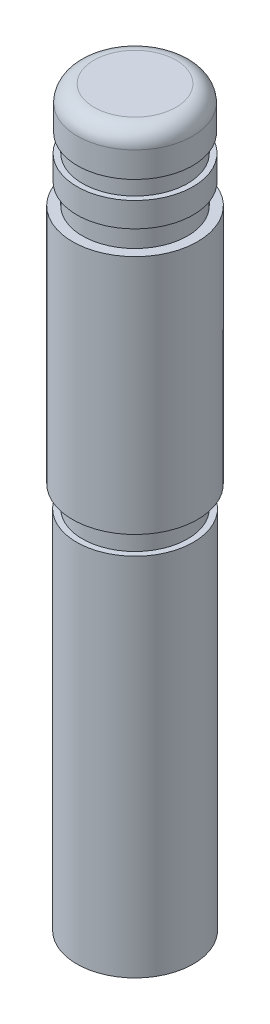
ISO-10303-21;
HEADER;
FILE_DESCRIPTION(('STEP AP214'),'2;1');
FILE_NAME('part.step','',(''),(''),'','','');
FILE_SCHEMA(('AUTOMOTIVE_DESIGN { 1 0 10303 214 1 1 1 1 }'));
ENDSEC;
DATA;
#1=APPLICATION_CONTEXT('core data for automotive mechanical design processes');
#2=APPLICATION_PROTOCOL_DEFINITION('international standard','automotive_design',2000,#1);
#3=PRODUCT_CONTEXT('',#1,'mechanical');
#4=PRODUCT('Part','Part','',(#3));
#5=PRODUCT_RELATED_PRODUCT_CATEGORY('part','',(#4));
#6=PRODUCT_DEFINITION_FORMATION('','',#4);
#7=PRODUCT_DEFINITION_CONTEXT('part definition',#1,'design');
#8=PRODUCT_DEFINITION('design','',#6,#7);
#9=PRODUCT_DEFINITION_SHAPE('','',#8);
#10=(LENGTH_UNIT() NAMED_UNIT(*) SI_UNIT(.MILLI.,.METRE.));
#11=(NAMED_UNIT(*) PLANE_ANGLE_UNIT() SI_UNIT($,.RADIAN.));
#12=(NAMED_UNIT(*) SI_UNIT($,.STERADIAN.) SOLID_ANGLE_UNIT());
#13=UNCERTAINTY_MEASURE_WITH_UNIT(LENGTH_MEASURE(1.E-05),#10,'distance_accuracy_value','');
#14=(GEOMETRIC_REPRESENTATION_CONTEXT(3) GLOBAL_UNCERTAINTY_ASSIGNED_CONTEXT((#13)) GLOBAL_UNIT_ASSIGNED_CONTEXT((#10,
#11,#12)) REPRESENTATION_CONTEXT('',''));
#15=CARTESIAN_POINT('',(0.,0.,0.));
#16=DIRECTION('',(0.,0.,1.));
#17=DIRECTION('',(1.,0.,0.));
#18=AXIS2_PLACEMENT_3D('',#15,#16,#17);
#19=CARTESIAN_POINT('',(0.,88.,4.9141476329733));
#20=DIRECTION('',(0.,-1.,0.));
#21=DIRECTION('',(0.,0.,-1.));
#22=AXIS2_PLACEMENT_3D('',#19,#20,#21);
#23=PLANE('',#22);
#24=CARTESIAN_POINT('',(0.,88.,0.));
#25=DIRECTION('',(0.,-1.,0.));
#26=DIRECTION('',(0.,0.,-1.));
#27=AXIS2_PLACEMENT_3D('',#24,#25,#26);
#28=CIRCLE('',#27,4.9141476329733);
#29=CARTESIAN_POINT('',(0.,88.,-4.9141476329733));
#30=VERTEX_POINT('',#29);
#31=EDGE_CURVE('E10',#30,#30,#28,.T.);
#32=ORIENTED_EDGE('',*,*,#31,.F.);
#33=EDGE_LOOP('',(#32));
#34=FACE_BOUND('',#33,.T.);
#35=ADVANCED_FACE('F33',(#34),#23,.F.);
#36=CARTESIAN_POINT('',(0.,86.,0.));
#37=DIRECTION('',(0.,-1.,0.));
#38=DIRECTION('',(0.,0.,-1.));
#39=AXIS2_PLACEMENT_3D('',#36,#37,#38);
#40=TOROIDAL_SURFACE('',#39,4.91414763297332,2.);
#41=CARTESIAN_POINT('',(0.,86.,0.));
#42=DIRECTION('',(0.,-1.,0.));
#43=DIRECTION('',(0.,0.,-1.));
#44=AXIS2_PLACEMENT_3D('',#41,#42,#43);
#45=CIRCLE('',#44,6.91414763297332);
#46=CARTESIAN_POINT('',(0.,86.,-6.91414763297332));
#47=VERTEX_POINT('',#46);
#48=EDGE_CURVE('E39',#47,#47,#45,.T.);
#49=ORIENTED_EDGE('',*,*,#48,.F.);
#50=EDGE_LOOP('',(#49));
#51=FACE_BOUND('',#50,.T.);
#52=ORIENTED_EDGE('',*,*,#31,.T.);
#53=EDGE_LOOP('',(#52));
#54=FACE_BOUND('',#53,.T.);
#55=ADVANCED_FACE('F162',(#51,#54),#40,.T.);
#56=CARTESIAN_POINT('',(0.,0.,0.));
#57=DIRECTION('',(0.,-1.,0.));
#58=DIRECTION('',(0.,0.,-1.));
#59=AXIS2_PLACEMENT_3D('',#56,#57,#58);
#60=CYLINDRICAL_SURFACE('',#59,6.91414763297332);
#61=CARTESIAN_POINT('',(0.,82.933330122629,0.));
#62=DIRECTION('',(0.,-1.,0.));
#63=DIRECTION('',(0.,0.,-1.));
#64=AXIS2_PLACEMENT_3D('',#61,#62,#63);
#65=CIRCLE('',#64,6.91414763297332);
#66=CARTESIAN_POINT('',(0.,82.933330122629,-6.91414763297332));
#67=VERTEX_POINT('',#66);
#68=EDGE_CURVE('E43',#67,#67,#65,.T.);
#69=ORIENTED_EDGE('',*,*,#68,.F.);
#70=EDGE_LOOP('',(#69));
#71=FACE_BOUND('',#70,.T.);
#72=ORIENTED_EDGE('',*,*,#48,.T.);
#73=EDGE_LOOP('',(#72));
#74=FACE_BOUND('',#73,.T.);
#75=ADVANCED_FACE('F157',(#71,#74),#60,.T.);
#76=CARTESIAN_POINT('',(0.,82.933330122629,6.30936461133419));
#77=DIRECTION('',(0.,1.,0.));
#78=DIRECTION('',(0.,0.,1.));
#79=AXIS2_PLACEMENT_3D('',#76,#77,#78);
#80=PLANE('',#79);
#81=CARTESIAN_POINT('',(0.,82.933330122629,0.));
#82=DIRECTION('',(0.,-1.,0.));
#83=DIRECTION('',(0.,0.,-1.));
#84=AXIS2_PLACEMENT_3D('',#81,#82,#83);
#85=CIRCLE('',#84,6.30936461133419);
#86=CARTESIAN_POINT('',(0.,82.933330122629,-6.30936461133419));
#87=VERTEX_POINT('',#86);
#88=EDGE_CURVE('E47',#87,#87,#85,.T.);
#89=ORIENTED_EDGE('',*,*,#88,.F.);
#90=EDGE_LOOP('',(#89));
#91=FACE_BOUND('',#90,.T.);
#92=ORIENTED_EDGE('',*,*,#68,.T.);
#93=EDGE_LOOP('',(#92));
#94=FACE_BOUND('',#93,.T.);
#95=ADVANCED_FACE('F151',(#91,#94),#80,.F.);
#96=CARTESIAN_POINT('',(0.,0.,0.));
#97=DIRECTION('',(0.,-1.,0.));
#98=DIRECTION('',(0.,0.,-1.));
#99=AXIS2_PLACEMENT_3D('',#96,#97,#98);
#100=CYLINDRICAL_SURFACE('',#99,6.30936461133419);
#101=CARTESIAN_POINT('',(0.,80.7809843571159,0.));
#102=DIRECTION('',(0.,-1.,0.));
#103=DIRECTION('',(0.,0.,-1.));
#104=AXIS2_PLACEMENT_3D('',#101,#102,#103);
#105=CIRCLE('',#104,6.30936461133419);
#106=CARTESIAN_POINT('',(0.,80.7809843571159,-6.30936461133419));
#107=VERTEX_POINT('',#106);
#108=EDGE_CURVE('E52',#107,#107,#105,.T.);
#109=ORIENTED_EDGE('',*,*,#108,.F.);
#110=EDGE_LOOP('',(#109));
#111=FACE_BOUND('',#110,.T.);
#112=ORIENTED_EDGE('',*,*,#88,.T.);
#113=EDGE_LOOP('',(#112));
#114=FACE_BOUND('',#113,.T.);
#115=ADVANCED_FACE('F145',(#111,#114),#100,.T.);
#116=CARTESIAN_POINT('',(0.,80.7809843571159,6.96064815312554));
#117=DIRECTION('',(0.,-1.,0.));
#118=DIRECTION('',(0.,0.,-1.));
#119=AXIS2_PLACEMENT_3D('',#116,#117,#118);
#120=PLANE('',#119);
#121=CARTESIAN_POINT('',(0.,80.7809843571159,0.));
#122=DIRECTION('',(0.,-1.,0.));
#123=DIRECTION('',(0.,0.,-1.));
#124=AXIS2_PLACEMENT_3D('',#121,#122,#123);
#125=CIRCLE('',#124,6.96064815312554);
#126=CARTESIAN_POINT('',(0.,80.7809843571159,-6.96064815312554));
#127=VERTEX_POINT('',#126);
#128=EDGE_CURVE('E55',#127,#127,#125,.T.);
#129=ORIENTED_EDGE('',*,*,#128,.F.);
#130=EDGE_LOOP('',(#129));
#131=FACE_BOUND('',#130,.T.);
#132=ORIENTED_EDGE('',*,*,#108,.T.);
#133=EDGE_LOOP('',(#132));
#134=FACE_BOUND('',#133,.T.);
#135=ADVANCED_FACE('F139',(#131,#134),#120,.F.);
#136=CARTESIAN_POINT('',(0.,0.,0.));
#137=DIRECTION('',(0.,-1.,0.));
#138=DIRECTION('',(0.,0.,-1.));
#139=AXIS2_PLACEMENT_3D('',#136,#137,#138);
#140=CYLINDRICAL_SURFACE('',#139,6.96064815312554);
#141=CARTESIAN_POINT('',(0.,77.8290833599733,0.));
#142=DIRECTION('',(0.,-1.,0.));
#143=DIRECTION('',(0.,0.,-1.));
#144=AXIS2_PLACEMENT_3D('',#141,#142,#143);
#145=CIRCLE('',#144,6.96064815312554);
#146=CARTESIAN_POINT('',(0.,77.8290833599733,-6.96064815312554));
#147=VERTEX_POINT('',#146);
#148=EDGE_CURVE('E58',#147,#147,#145,.T.);
#149=ORIENTED_EDGE('',*,*,#148,.F.);
#150=EDGE_LOOP('',(#149));
#151=FACE_BOUND('',#150,.T.);
#152=ORIENTED_EDGE('',*,*,#128,.T.);
#153=EDGE_LOOP('',(#152));
#154=FACE_BOUND('',#153,.T.);
#155=ADVANCED_FACE('F133',(#151,#154),#140,.T.);
#156=CARTESIAN_POINT('',(0.,77.8290833599733,6.30936461133419));
#157=DIRECTION('',(0.,1.,0.));
#158=DIRECTION('',(0.,0.,1.));
#159=AXIS2_PLACEMENT_3D('',#156,#157,#158);
#160=PLANE('',#159);
#161=CARTESIAN_POINT('',(0.,77.8290833599733,0.));
#162=DIRECTION('',(0.,-1.,0.));
#163=DIRECTION('',(0.,0.,-1.));
#164=AXIS2_PLACEMENT_3D('',#161,#162,#163);
#165=CIRCLE('',#164,6.30936461133419);
#166=CARTESIAN_POINT('',(0.,77.8290833599733,-6.30936461133419));
#167=VERTEX_POINT('',#166);
#168=EDGE_CURVE('E61',#167,#167,#165,.T.);
#169=ORIENTED_EDGE('',*,*,#168,.F.);
#170=EDGE_LOOP('',(#169));
#171=FACE_BOUND('',#170,.T.);
#172=ORIENTED_EDGE('',*,*,#148,.T.);
#173=EDGE_LOOP('',(#172));
#174=FACE_BOUND('',#173,.T.);
#175=ADVANCED_FACE('F127',(#171,#174),#160,.F.);
#176=CARTESIAN_POINT('',(0.,0.,0.));
#177=DIRECTION('',(0.,-1.,0.));
#178=DIRECTION('',(0.,0.,-1.));
#179=AXIS2_PLACEMENT_3D('',#176,#177,#178);
#180=CYLINDRICAL_SURFACE('',#179,6.30936461133419);
#181=CARTESIAN_POINT('',(0.,75.3283813623714,0.));
#182=DIRECTION('',(0.,-1.,0.));
#183=DIRECTION('',(0.,0.,-1.));
#184=AXIS2_PLACEMENT_3D('',#181,#182,#183);
#185=CIRCLE('',#184,6.30936461133419);
#186=CARTESIAN_POINT('',(0.,75.3283813623714,-6.30936461133419));
#187=VERTEX_POINT('',#186);
#188=EDGE_CURVE('E64',#187,#187,#185,.T.);
#189=ORIENTED_EDGE('',*,*,#188,.F.);
#190=EDGE_LOOP('',(#189));
#191=FACE_BOUND('',#190,.T.);
#192=ORIENTED_EDGE('',*,*,#168,.T.);
#193=EDGE_LOOP('',(#192));
#194=FACE_BOUND('',#193,.T.);
#195=ADVANCED_FACE('F121',(#191,#194),#180,.T.);
#196=CARTESIAN_POINT('',(0.,75.3283813623714,7.5));
#197=DIRECTION('',(0.,-1.,0.));
#198=DIRECTION('',(0.,0.,-1.));
#199=AXIS2_PLACEMENT_3D('',#196,#197,#198);
#200=PLANE('',#199);
#201=CARTESIAN_POINT('',(0.,75.3283813623714,0.));
#202=DIRECTION('',(0.,-1.,0.));
#203=DIRECTION('',(0.,0.,-1.));
#204=AXIS2_PLACEMENT_3D('',#201,#202,#203);
#205=CIRCLE('',#204,7.5);
#206=CARTESIAN_POINT('',(0.,75.3283813623714,-7.5));
#207=VERTEX_POINT('',#206);
#208=EDGE_CURVE('E67',#207,#207,#205,.T.);
#209=ORIENTED_EDGE('',*,*,#208,.F.);
#210=EDGE_LOOP('',(#209));
#211=FACE_BOUND('',#210,.T.);
#212=ORIENTED_EDGE('',*,*,#188,.T.);
#213=EDGE_LOOP('',(#212));
#214=FACE_BOUND('',#213,.T.);
#215=ADVANCED_FACE('F115',(#211,#214),#200,.F.);
#216=CARTESIAN_POINT('',(0.,0.,0.));
#217=DIRECTION('',(0.,-1.,0.));
#218=DIRECTION('',(0.,0.,-1.));
#219=AXIS2_PLACEMENT_3D('',#216,#217,#218);
#220=CYLINDRICAL_SURFACE('',#219,7.5);
#221=CARTESIAN_POINT('',(0.,46.44715169455,0.));
#222=DIRECTION('',(0.,-1.,0.));
#223=DIRECTION('',(0.,0.,-1.));
#224=AXIS2_PLACEMENT_3D('',#221,#222,#223);
#225=CIRCLE('',#224,7.5);
#226=CARTESIAN_POINT('',(0.,46.44715169455,-7.5));
#227=VERTEX_POINT('',#226);
#228=EDGE_CURVE('E70',#227,#227,#225,.T.);
#229=ORIENTED_EDGE('',*,*,#228,.F.);
#230=EDGE_LOOP('',(#229));
#231=FACE_BOUND('',#230,.T.);
#232=ORIENTED_EDGE('',*,*,#208,.T.);
#233=EDGE_LOOP('',(#232));
#234=FACE_BOUND('',#233,.T.);
#235=ADVANCED_FACE('F109',(#231,#234),#220,.T.);
#236=CARTESIAN_POINT('',(0.,46.44715169455,6.30936461133419));
#237=DIRECTION('',(0.,1.,0.));
#238=DIRECTION('',(0.,0.,1.));
#239=AXIS2_PLACEMENT_3D('',#236,#237,#238);
#240=PLANE('',#239);
#241=CARTESIAN_POINT('',(0.,46.44715169455,0.));
#242=DIRECTION('',(0.,-1.,0.));
#243=DIRECTION('',(0.,0.,-1.));
#244=AXIS2_PLACEMENT_3D('',#241,#242,#243);
#245=CIRCLE('',#244,6.30936461133419);
#246=CARTESIAN_POINT('',(0.,46.44715169455,-6.30936461133419));
#247=VERTEX_POINT('',#246);
#248=EDGE_CURVE('E73',#247,#247,#245,.T.);
#249=ORIENTED_EDGE('',*,*,#248,.F.);
#250=EDGE_LOOP('',(#249));
#251=FACE_BOUND('',#250,.T.);
#252=ORIENTED_EDGE('',*,*,#228,.T.);
#253=EDGE_LOOP('',(#252));
#254=FACE_BOUND('',#253,.T.);
#255=ADVANCED_FACE('F103',(#251,#254),#240,.F.);
#256=CARTESIAN_POINT('',(0.,0.,0.));
#257=DIRECTION('',(0.,-1.,0.));
#258=DIRECTION('',(0.,0.,-1.));
#259=AXIS2_PLACEMENT_3D('',#256,#257,#258);
#260=CYLINDRICAL_SURFACE('',#259,6.30936461133419);
#261=CARTESIAN_POINT('',(0.,43.8356448780115,0.));
#262=DIRECTION('',(0.,-1.,0.));
#263=DIRECTION('',(0.,0.,-1.));
#264=AXIS2_PLACEMENT_3D('',#261,#262,#263);
#265=CIRCLE('',#264,6.30936461133419);
#266=CARTESIAN_POINT('',(0.,43.8356448780115,-6.30936461133419));
#267=VERTEX_POINT('',#266);
#268=EDGE_CURVE('E76',#267,#267,#265,.T.);
#269=ORIENTED_EDGE('',*,*,#268,.F.);
#270=EDGE_LOOP('',(#269));
#271=FACE_BOUND('',#270,.T.);
#272=ORIENTED_EDGE('',*,*,#248,.T.);
#273=EDGE_LOOP('',(#272));
#274=FACE_BOUND('',#273,.T.);
#275=ADVANCED_FACE('F97',(#271,#274),#260,.T.);
#276=CARTESIAN_POINT('',(0.,43.8356448780115,7.));
#277=DIRECTION('',(0.,-1.,0.));
#278=DIRECTION('',(0.,0.,-1.));
#279=AXIS2_PLACEMENT_3D('',#276,#277,#278);
#280=PLANE('',#279);
#281=CARTESIAN_POINT('',(0.,43.8356448780115,0.));
#282=DIRECTION('',(0.,-1.,0.));
#283=DIRECTION('',(0.,0.,-1.));
#284=AXIS2_PLACEMENT_3D('',#281,#282,#283);
#285=CIRCLE('',#284,7.);
#286=CARTESIAN_POINT('',(0.,43.8356448780115,-7.));
#287=VERTEX_POINT('',#286);
#288=EDGE_CURVE('E79',#287,#287,#285,.T.);
#289=ORIENTED_EDGE('',*,*,#288,.F.);
#290=EDGE_LOOP('',(#289));
#291=FACE_BOUND('',#290,.T.);
#292=ORIENTED_EDGE('',*,*,#268,.T.);
#293=EDGE_LOOP('',(#292));
#294=FACE_BOUND('',#293,.T.);
#295=ADVANCED_FACE('F91',(#291,#294),#280,.F.);
#296=CARTESIAN_POINT('',(0.,0.,0.));
#297=DIRECTION('',(0.,-1.,0.));
#298=DIRECTION('',(0.,0.,-1.));
#299=AXIS2_PLACEMENT_3D('',#296,#297,#298);
#300=CYLINDRICAL_SURFACE('',#299,7.);
#301=CARTESIAN_POINT('',(0.,0.,0.));
#302=DIRECTION('',(0.,-1.,0.));
#303=DIRECTION('',(0.,0.,-1.));
#304=AXIS2_PLACEMENT_3D('',#301,#302,#303);
#305=CIRCLE('',#304,7.);
#306=CARTESIAN_POINT('',(0.,0.,-7.));
#307=VERTEX_POINT('',#306);
#308=EDGE_CURVE('E82',#307,#307,#305,.T.);
#309=ORIENTED_EDGE('',*,*,#308,.F.);
#310=EDGE_LOOP('',(#309));
#311=FACE_BOUND('',#310,.T.);
#312=ORIENTED_EDGE('',*,*,#288,.T.);
#313=EDGE_LOOP('',(#312));
#314=FACE_BOUND('',#313,.T.);
#315=ADVANCED_FACE('F88',(#311,#314),#300,.T.);
#316=CARTESIAN_POINT('',(0.,0.,7.));
#317=DIRECTION('',(0.,1.,0.));
#318=DIRECTION('',(0.,0.,1.));
#319=AXIS2_PLACEMENT_3D('',#316,#317,#318);
#320=PLANE('',#319);
#321=ORIENTED_EDGE('',*,*,#308,.T.);
#322=EDGE_LOOP('',(#321));
#323=FACE_BOUND('',#322,.T.);
#324=ADVANCED_FACE('F86',(#323),#320,.F.);
#325=CLOSED_SHELL('',(#35,#55,#75,#95,#115,#135,#155,#175,#195,#215,#235,#255,#275,#295,#315,#324));
#326=MANIFOLD_SOLID_BREP('B2',#325);
#327=ADVANCED_BREP_SHAPE_REPRESENTATION('',(#18,#326),#14);
#328=SHAPE_DEFINITION_REPRESENTATION(#9,#327);
ENDSEC;
END-ISO-10303-21;
